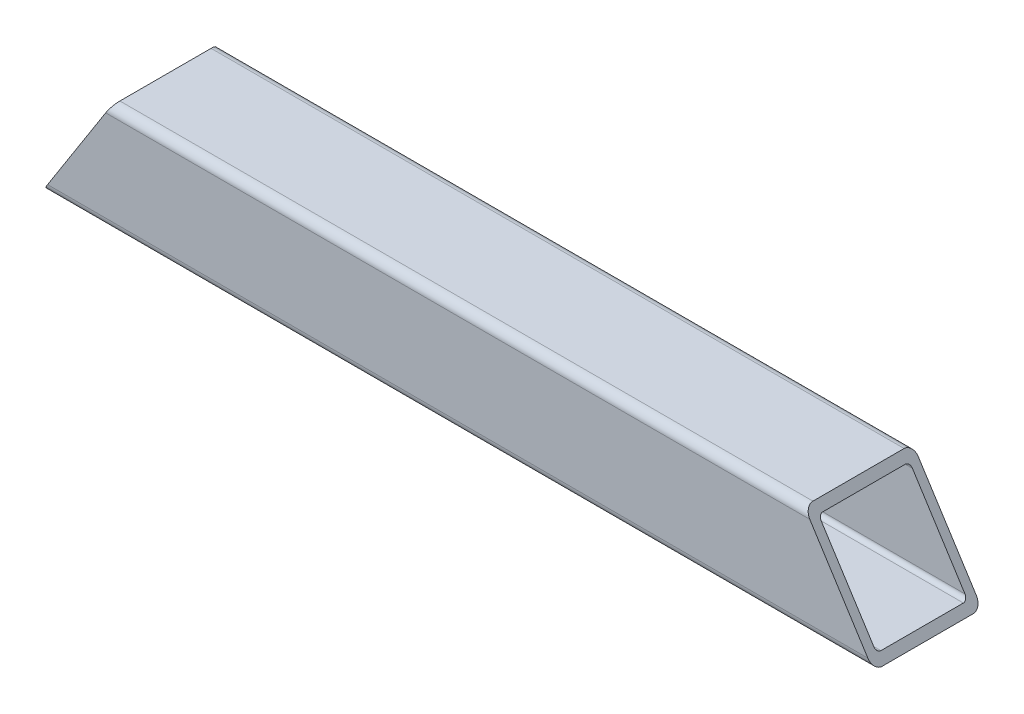
ISO-10303-21;
HEADER;
FILE_DESCRIPTION(('STEP AP214'),'2;1');
FILE_NAME('part.step','',(''),(''),'','','');
FILE_SCHEMA(('AUTOMOTIVE_DESIGN { 1 0 10303 214 1 1 1 1 }'));
ENDSEC;
DATA;
#1=APPLICATION_CONTEXT('core data for automotive mechanical design processes');
#2=APPLICATION_PROTOCOL_DEFINITION('international standard','automotive_design',2000,#1);
#3=PRODUCT_CONTEXT('',#1,'mechanical');
#4=PRODUCT('Part','Part','',(#3));
#5=PRODUCT_RELATED_PRODUCT_CATEGORY('part','',(#4));
#6=PRODUCT_DEFINITION_FORMATION('','',#4);
#7=PRODUCT_DEFINITION_CONTEXT('part definition',#1,'design');
#8=PRODUCT_DEFINITION('design','',#6,#7);
#9=PRODUCT_DEFINITION_SHAPE('','',#8);
#10=(LENGTH_UNIT() NAMED_UNIT(*) SI_UNIT(.MILLI.,.METRE.));
#11=(NAMED_UNIT(*) PLANE_ANGLE_UNIT() SI_UNIT($,.RADIAN.));
#12=(NAMED_UNIT(*) SI_UNIT($,.STERADIAN.) SOLID_ANGLE_UNIT());
#13=UNCERTAINTY_MEASURE_WITH_UNIT(LENGTH_MEASURE(1.E-05),#10,'distance_accuracy_value','');
#14=(GEOMETRIC_REPRESENTATION_CONTEXT(3) GLOBAL_UNCERTAINTY_ASSIGNED_CONTEXT((#13)) GLOBAL_UNIT_ASSIGNED_CONTEXT((#10,
#11,#12)) REPRESENTATION_CONTEXT('',''));
#15=CARTESIAN_POINT('',(0.,0.,0.));
#16=DIRECTION('',(0.,0.,1.));
#17=DIRECTION('',(1.,0.,0.));
#18=AXIS2_PLACEMENT_3D('',#15,#16,#17);
#19=CARTESIAN_POINT('',(191.5,10.5,9.5));
#20=DIRECTION('',(0.,-1.,0.));
#21=DIRECTION('',(0.,0.,-1.));
#22=AXIS2_PLACEMENT_3D('',#19,#20,#21);
#23=PLANE('',#22);
#24=DIRECTION('',(0.,0.,-1.));
#25=VECTOR('',#24,1.);
#26=CARTESIAN_POINT('',(14.6526159985721,10.5,-12.501));
#27=LINE('',#26,#25);
#28=CARTESIAN_POINT('',(14.6526159985721,10.5,9.5));
#29=VERTEX_POINT('',#28);
#30=CARTESIAN_POINT('',(14.6526159985721,10.5,-9.50000000000001));
#31=VERTEX_POINT('',#30);
#32=EDGE_CURVE('E482',#29,#31,#27,.T.);
#33=ORIENTED_EDGE('',*,*,#32,.T.);
#34=DIRECTION('',(-1.,0.,0.));
#35=VECTOR('',#34,1.);
#36=CARTESIAN_POINT('',(191.5,10.5,-9.50000000000001));
#37=LINE('',#36,#35);
#38=CARTESIAN_POINT('',(176.847384001428,10.5,-9.50000000000001));
#39=VERTEX_POINT('',#38);
#40=EDGE_CURVE('E284',#39,#31,#37,.T.);
#41=ORIENTED_EDGE('',*,*,#40,.F.);
#42=DIRECTION('',(0.,0.,1.));
#43=VECTOR('',#42,1.);
#44=CARTESIAN_POINT('',(176.847384001428,10.5,-12.501));
#45=LINE('',#44,#43);
#46=CARTESIAN_POINT('',(176.847384001428,10.5,9.5));
#47=VERTEX_POINT('',#46);
#48=EDGE_CURVE('E248',#39,#47,#45,.T.);
#49=ORIENTED_EDGE('',*,*,#48,.T.);
#50=DIRECTION('',(-1.,0.,0.));
#51=VECTOR('',#50,1.);
#52=CARTESIAN_POINT('',(191.5,10.5,9.5));
#53=LINE('',#52,#51);
#54=EDGE_CURVE('E233',#47,#29,#53,.T.);
#55=ORIENTED_EDGE('',*,*,#54,.T.);
#56=EDGE_LOOP('',(#33,#41,#49,#55));
#57=FACE_BOUND('',#56,.T.);
#58=ADVANCED_FACE('F39',(#57),#23,.T.);
#59=CARTESIAN_POINT('',(191.5,9.50000000000001,-9.50000000000001));
#60=DIRECTION('',(-1.,0.,0.));
#61=DIRECTION('',(0.,0.,1.));
#62=AXIS2_PLACEMENT_3D('',#59,#60,#61);
#63=CYLINDRICAL_SURFACE('',#62,0.999999999999999);
#64=CARTESIAN_POINT('',(14.0155457377647,9.50000000000001,-9.50000000000001));
#65=DIRECTION('',(0.843391445812889,-0.537299608346818,0.));
#66=DIRECTION('',(-0.537299608346819,-0.843391445812889,0.));
#67=AXIS2_PLACEMENT_3D('',#64,#65,#66);
#68=ELLIPSE('',#67,1.18568904743415,0.999999999999999);
#69=CARTESIAN_POINT('',(14.0155457377647,9.50000000000001,-10.5));
#70=VERTEX_POINT('',#69);
#71=EDGE_CURVE('E63',#31,#70,#68,.F.);
#72=ORIENTED_EDGE('',*,*,#71,.T.);
#73=DIRECTION('',(-1.,0.,0.));
#74=VECTOR('',#73,1.);
#75=CARTESIAN_POINT('',(191.5,9.50000000000001,-10.5));
#76=LINE('',#75,#74);
#77=CARTESIAN_POINT('',(177.484454262235,9.50000000000001,-10.5));
#78=VERTEX_POINT('',#77);
#79=EDGE_CURVE('E288',#78,#70,#76,.T.);
#80=ORIENTED_EDGE('',*,*,#79,.F.);
#81=CARTESIAN_POINT('',(177.484454262235,9.50000000000001,-9.50000000000001));
#82=DIRECTION('',(-0.843391445812889,-0.537299608346818,0.));
#83=DIRECTION('',(-0.537299608346819,0.843391445812889,0.));
#84=AXIS2_PLACEMENT_3D('',#81,#82,#83);
#85=ELLIPSE('',#84,1.18568904743415,0.999999999999999);
#86=EDGE_CURVE('E251',#78,#39,#85,.F.);
#87=ORIENTED_EDGE('',*,*,#86,.T.);
#88=ORIENTED_EDGE('',*,*,#40,.T.);
#89=EDGE_LOOP('',(#72,#80,#87,#88));
#90=FACE_BOUND('',#89,.T.);
#91=ADVANCED_FACE('F323',(#90),#63,.F.);
#92=CARTESIAN_POINT('',(191.5,9.50000000000001,-10.5));
#93=DIRECTION('',(0.,0.,1.));
#94=DIRECTION('',(1.,0.,0.));
#95=AXIS2_PLACEMENT_3D('',#92,#93,#94);
#96=PLANE('',#95);
#97=DIRECTION('',(-0.537299608346819,-0.843391445812889,0.));
#98=VECTOR('',#97,1.);
#99=CARTESIAN_POINT('',(0.,-12.5,-10.5));
#100=LINE('',#99,#98);
#101=CARTESIAN_POINT('',(1.91121078242253,-9.49999999999997,-10.5));
#102=VERTEX_POINT('',#101);
#103=EDGE_CURVE('E488',#70,#102,#100,.T.);
#104=ORIENTED_EDGE('',*,*,#103,.T.);
#105=DIRECTION('',(-1.,0.,0.));
#106=VECTOR('',#105,1.);
#107=CARTESIAN_POINT('',(191.5,-9.49999999999999,-10.5));
#108=LINE('',#107,#106);
#109=CARTESIAN_POINT('',(189.588789217578,-9.49999999999999,-10.5));
#110=VERTEX_POINT('',#109);
#111=EDGE_CURVE('E292',#110,#102,#108,.T.);
#112=ORIENTED_EDGE('',*,*,#111,.F.);
#113=DIRECTION('',(-0.537299608346819,0.843391445812889,0.));
#114=VECTOR('',#113,1.);
#115=CARTESIAN_POINT('',(191.5,-12.5,-10.5));
#116=LINE('',#115,#114);
#117=EDGE_CURVE('E255',#110,#78,#116,.T.);
#118=ORIENTED_EDGE('',*,*,#117,.T.);
#119=ORIENTED_EDGE('',*,*,#79,.T.);
#120=EDGE_LOOP('',(#104,#112,#118,#119));
#121=FACE_BOUND('',#120,.T.);
#122=ADVANCED_FACE('F329',(#121),#96,.T.);
#123=CARTESIAN_POINT('',(191.5,-9.5,-9.50000000000001));
#124=DIRECTION('',(-1.,0.,0.));
#125=DIRECTION('',(0.,0.,1.));
#126=AXIS2_PLACEMENT_3D('',#123,#124,#125);
#127=CYLINDRICAL_SURFACE('',#126,0.999999999999999);
#128=CARTESIAN_POINT('',(1.91121078242246,-9.5,-9.50000000000001));
#129=DIRECTION('',(0.843391445812889,-0.537299608346818,0.));
#130=DIRECTION('',(-0.537299608346819,-0.843391445812889,0.));
#131=AXIS2_PLACEMENT_3D('',#128,#129,#130);
#132=ELLIPSE('',#131,1.18568904743415,0.999999999999999);
#133=CARTESIAN_POINT('',(1.27414052161498,-10.5,-9.50000000000001));
#134=VERTEX_POINT('',#133);
#135=EDGE_CURVE('E495',#102,#134,#132,.F.);
#136=ORIENTED_EDGE('',*,*,#135,.T.);
#137=DIRECTION('',(-1.,0.,0.));
#138=VECTOR('',#137,1.);
#139=CARTESIAN_POINT('',(191.5,-10.5,-9.50000000000001));
#140=LINE('',#139,#138);
#141=CARTESIAN_POINT('',(190.225859478385,-10.5,-9.50000000000001));
#142=VERTEX_POINT('',#141);
#143=EDGE_CURVE('E296',#142,#134,#140,.T.);
#144=ORIENTED_EDGE('',*,*,#143,.F.);
#145=CARTESIAN_POINT('',(189.588789217578,-9.5,-9.50000000000001));
#146=DIRECTION('',(-0.843391445812889,-0.537299608346818,0.));
#147=DIRECTION('',(-0.537299608346819,0.843391445812889,0.));
#148=AXIS2_PLACEMENT_3D('',#145,#146,#147);
#149=ELLIPSE('',#148,1.18568904743415,0.999999999999999);
#150=EDGE_CURVE('E259',#142,#110,#149,.F.);
#151=ORIENTED_EDGE('',*,*,#150,.T.);
#152=ORIENTED_EDGE('',*,*,#111,.T.);
#153=EDGE_LOOP('',(#136,#144,#151,#152));
#154=FACE_BOUND('',#153,.T.);
#155=ADVANCED_FACE('F336',(#154),#127,.F.);
#156=CARTESIAN_POINT('',(191.5,-10.5,9.5));
#157=DIRECTION('',(0.,1.,0.));
#158=DIRECTION('',(0.,0.,1.));
#159=AXIS2_PLACEMENT_3D('',#156,#157,#158);
#160=PLANE('',#159);
#161=DIRECTION('',(0.,0.,1.));
#162=VECTOR('',#161,1.);
#163=CARTESIAN_POINT('',(1.27414052161497,-10.5,-12.501));
#164=LINE('',#163,#162);
#165=CARTESIAN_POINT('',(1.27414052161498,-10.5,9.5));
#166=VERTEX_POINT('',#165);
#167=EDGE_CURVE('E499',#134,#166,#164,.T.);
#168=ORIENTED_EDGE('',*,*,#167,.T.);
#169=DIRECTION('',(-1.,0.,0.));
#170=VECTOR('',#169,1.);
#171=CARTESIAN_POINT('',(191.5,-10.5,9.5));
#172=LINE('',#171,#170);
#173=CARTESIAN_POINT('',(190.225859478385,-10.5,9.5));
#174=VERTEX_POINT('',#173);
#175=EDGE_CURVE('E300',#174,#166,#172,.T.);
#176=ORIENTED_EDGE('',*,*,#175,.F.);
#177=DIRECTION('',(0.,0.,-1.));
#178=VECTOR('',#177,1.);
#179=CARTESIAN_POINT('',(190.225859478385,-10.5,-12.501));
#180=LINE('',#179,#178);
#181=EDGE_CURVE('E263',#174,#142,#180,.T.);
#182=ORIENTED_EDGE('',*,*,#181,.T.);
#183=ORIENTED_EDGE('',*,*,#143,.T.);
#184=EDGE_LOOP('',(#168,#176,#182,#183));
#185=FACE_BOUND('',#184,.T.);
#186=ADVANCED_FACE('F340',(#185),#160,.T.);
#187=CARTESIAN_POINT('',(191.5,-9.5,9.5));
#188=DIRECTION('',(-1.,0.,0.));
#189=DIRECTION('',(0.,0.,1.));
#190=AXIS2_PLACEMENT_3D('',#187,#188,#189);
#191=CYLINDRICAL_SURFACE('',#190,1.);
#192=CARTESIAN_POINT('',(1.91121078242246,-9.5,9.5));
#193=DIRECTION('',(0.843391445812889,-0.537299608346818,0.));
#194=DIRECTION('',(-0.537299608346819,-0.843391445812889,0.));
#195=AXIS2_PLACEMENT_3D('',#192,#193,#194);
#196=ELLIPSE('',#195,1.18568904743416,1.);
#197=CARTESIAN_POINT('',(1.91121078242246,-9.5,10.5));
#198=VERTEX_POINT('',#197);
#199=EDGE_CURVE('E503',#166,#198,#196,.F.);
#200=ORIENTED_EDGE('',*,*,#199,.T.);
#201=DIRECTION('',(-1.,0.,0.));
#202=VECTOR('',#201,1.);
#203=CARTESIAN_POINT('',(191.5,-9.5,10.5));
#204=LINE('',#203,#202);
#205=CARTESIAN_POINT('',(189.588789217578,-9.5,10.5));
#206=VERTEX_POINT('',#205);
#207=EDGE_CURVE('E304',#206,#198,#204,.T.);
#208=ORIENTED_EDGE('',*,*,#207,.F.);
#209=CARTESIAN_POINT('',(189.588789217578,-9.5,9.5));
#210=DIRECTION('',(-0.843391445812889,-0.537299608346818,0.));
#211=DIRECTION('',(-0.537299608346819,0.843391445812889,0.));
#212=AXIS2_PLACEMENT_3D('',#209,#210,#211);
#213=ELLIPSE('',#212,1.18568904743416,1.);
#214=EDGE_CURVE('E267',#206,#174,#213,.F.);
#215=ORIENTED_EDGE('',*,*,#214,.T.);
#216=ORIENTED_EDGE('',*,*,#175,.T.);
#217=EDGE_LOOP('',(#200,#208,#215,#216));
#218=FACE_BOUND('',#217,.T.);
#219=ADVANCED_FACE('F344',(#218),#191,.F.);
#220=CARTESIAN_POINT('',(191.5,9.50000000000001,10.5));
#221=DIRECTION('',(0.,0.,-1.));
#222=DIRECTION('',(-1.,0.,0.));
#223=AXIS2_PLACEMENT_3D('',#220,#221,#222);
#224=PLANE('',#223);
#225=DIRECTION('',(0.537299608346819,0.843391445812889,0.));
#226=VECTOR('',#225,1.);
#227=CARTESIAN_POINT('',(0.,-12.5,10.5));
#228=LINE('',#227,#226);
#229=CARTESIAN_POINT('',(14.0155457377647,9.50000000000003,10.5));
#230=VERTEX_POINT('',#229);
#231=EDGE_CURVE('E507',#198,#230,#228,.T.);
#232=ORIENTED_EDGE('',*,*,#231,.T.);
#233=DIRECTION('',(-1.,0.,0.));
#234=VECTOR('',#233,1.);
#235=CARTESIAN_POINT('',(191.5,9.50000000000001,10.5));
#236=LINE('',#235,#234);
#237=CARTESIAN_POINT('',(177.484454262235,9.50000000000001,10.5));
#238=VERTEX_POINT('',#237);
#239=EDGE_CURVE('E165',#238,#230,#236,.T.);
#240=ORIENTED_EDGE('',*,*,#239,.F.);
#241=DIRECTION('',(0.537299608346819,-0.843391445812889,0.));
#242=VECTOR('',#241,1.);
#243=CARTESIAN_POINT('',(191.5,-12.5,10.5));
#244=LINE('',#243,#242);
#245=EDGE_CURVE('E271',#238,#206,#244,.T.);
#246=ORIENTED_EDGE('',*,*,#245,.T.);
#247=ORIENTED_EDGE('',*,*,#207,.T.);
#248=EDGE_LOOP('',(#232,#240,#246,#247));
#249=FACE_BOUND('',#248,.T.);
#250=ADVANCED_FACE('F348',(#249),#224,.T.);
#251=CARTESIAN_POINT('',(191.5,9.50000000000001,9.5));
#252=DIRECTION('',(-1.,0.,0.));
#253=DIRECTION('',(0.,0.,1.));
#254=AXIS2_PLACEMENT_3D('',#251,#252,#253);
#255=CYLINDRICAL_SURFACE('',#254,1.);
#256=CARTESIAN_POINT('',(14.0155457377647,9.50000000000001,9.5));
#257=DIRECTION('',(0.843391445812889,-0.537299608346818,0.));
#258=DIRECTION('',(-0.537299608346819,-0.843391445812889,0.));
#259=AXIS2_PLACEMENT_3D('',#256,#257,#258);
#260=ELLIPSE('',#259,1.18568904743416,1.);
#261=EDGE_CURVE('E223',#230,#29,#260,.F.);
#262=ORIENTED_EDGE('',*,*,#261,.T.);
#263=ORIENTED_EDGE('',*,*,#54,.F.);
#264=CARTESIAN_POINT('',(177.484454262235,9.50000000000001,9.5));
#265=DIRECTION('',(-0.843391445812889,-0.537299608346818,0.));
#266=DIRECTION('',(-0.537299608346819,0.843391445812889,0.));
#267=AXIS2_PLACEMENT_3D('',#264,#265,#266);
#268=ELLIPSE('',#267,1.18568904743416,1.);
#269=EDGE_CURVE('E55',#47,#238,#268,.F.);
#270=ORIENTED_EDGE('',*,*,#269,.T.);
#271=ORIENTED_EDGE('',*,*,#239,.T.);
#272=EDGE_LOOP('',(#262,#263,#270,#271));
#273=FACE_BOUND('',#272,.T.);
#274=ADVANCED_FACE('F352',(#273),#255,.F.);
#275=CARTESIAN_POINT('',(191.5,-12.5,-12.501));
#276=DIRECTION('',(-0.843391445812889,-0.537299608346818,0.));
#277=DIRECTION('',(0.537299608346819,-0.843391445812889,0.));
#278=AXIS2_PLACEMENT_3D('',#275,#276,#277);
#279=PLANE('',#278);
#280=ORIENTED_EDGE('',*,*,#48,.F.);
#281=ORIENTED_EDGE('',*,*,#86,.F.);
#282=ORIENTED_EDGE('',*,*,#117,.F.);
#283=ORIENTED_EDGE('',*,*,#150,.F.);
#284=ORIENTED_EDGE('',*,*,#181,.F.);
#285=ORIENTED_EDGE('',*,*,#214,.F.);
#286=ORIENTED_EDGE('',*,*,#245,.F.);
#287=ORIENTED_EDGE('',*,*,#269,.F.);
#288=EDGE_LOOP('',(#280,#281,#282,#283,#284,#285,#286,#287));
#289=FACE_BOUND('',#288,.T.);
#290=CARTESIAN_POINT('',(190.225859478385,-10.5,-10.5));
#291=DIRECTION('',(-0.843391445812889,-0.537299608346818,0.));
#292=DIRECTION('',(-0.537299608346819,0.843391445812889,0.));
#293=AXIS2_PLACEMENT_3D('',#290,#291,#292);
#294=ELLIPSE('',#293,2.37137809486831,2.);
#295=CARTESIAN_POINT('',(191.5,-12.5,-10.5));
#296=VERTEX_POINT('',#295);
#297=CARTESIAN_POINT('',(190.225859478385,-10.5,-12.5));
#298=VERTEX_POINT('',#297);
#299=EDGE_CURVE('E178',#296,#298,#294,.F.);
#300=ORIENTED_EDGE('',*,*,#299,.T.);
#301=DIRECTION('',(-0.537299608346819,0.843391445812889,0.));
#302=VECTOR('',#301,1.);
#303=CARTESIAN_POINT('',(191.5,-12.5,-12.5));
#304=LINE('',#303,#302);
#305=CARTESIAN_POINT('',(176.847384001428,10.5,-12.5));
#306=VERTEX_POINT('',#305);
#307=EDGE_CURVE('E214',#298,#306,#304,.T.);
#308=ORIENTED_EDGE('',*,*,#307,.T.);
#309=CARTESIAN_POINT('',(176.847384001428,10.5,-10.5));
#310=DIRECTION('',(-0.843391445812889,-0.537299608346818,0.));
#311=DIRECTION('',(-0.537299608346819,0.843391445812889,0.));
#312=AXIS2_PLACEMENT_3D('',#309,#310,#311);
#313=ELLIPSE('',#312,2.37137809486831,2.);
#314=CARTESIAN_POINT('',(175.573243479813,12.5,-10.5));
#315=VERTEX_POINT('',#314);
#316=EDGE_CURVE('E209',#306,#315,#313,.F.);
#317=ORIENTED_EDGE('',*,*,#316,.T.);
#318=DIRECTION('',(0.,0.,1.));
#319=VECTOR('',#318,1.);
#320=CARTESIAN_POINT('',(175.573243479813,12.5,-12.501));
#321=LINE('',#320,#319);
#322=CARTESIAN_POINT('',(175.573243479813,12.5,10.5));
#323=VERTEX_POINT('',#322);
#324=EDGE_CURVE('E245',#315,#323,#321,.T.);
#325=ORIENTED_EDGE('',*,*,#324,.T.);
#326=CARTESIAN_POINT('',(176.847384001428,10.5,10.5));
#327=DIRECTION('',(-0.843391445812889,-0.537299608346818,0.));
#328=DIRECTION('',(-0.537299608346819,0.843391445812889,0.));
#329=AXIS2_PLACEMENT_3D('',#326,#327,#328);
#330=ELLIPSE('',#329,2.37137809486831,2.);
#331=CARTESIAN_POINT('',(176.847384001428,10.5,12.5));
#332=VERTEX_POINT('',#331);
#333=EDGE_CURVE('E237',#323,#332,#330,.F.);
#334=ORIENTED_EDGE('',*,*,#333,.T.);
#335=DIRECTION('',(0.537299608346818,-0.843391445812889,0.));
#336=VECTOR('',#335,1.);
#337=CARTESIAN_POINT('',(191.5,-12.5,12.5));
#338=LINE('',#337,#336);
#339=CARTESIAN_POINT('',(190.225859478385,-10.5,12.5));
#340=VERTEX_POINT('',#339);
#341=EDGE_CURVE('E242',#332,#340,#338,.T.);
#342=ORIENTED_EDGE('',*,*,#341,.T.);
#343=CARTESIAN_POINT('',(190.225859478385,-10.5,10.5));
#344=DIRECTION('',(-0.843391445812889,-0.537299608346818,0.));
#345=DIRECTION('',(-0.537299608346819,0.843391445812889,0.));
#346=AXIS2_PLACEMENT_3D('',#343,#344,#345);
#347=ELLIPSE('',#346,2.37137809486831,2.);
#348=CARTESIAN_POINT('',(191.5,-12.5,10.5));
#349=VERTEX_POINT('',#348);
#350=EDGE_CURVE('E234',#340,#349,#347,.F.);
#351=ORIENTED_EDGE('',*,*,#350,.T.);
#352=DIRECTION('',(0.,0.,-1.));
#353=VECTOR('',#352,1.);
#354=CARTESIAN_POINT('',(191.5,-12.5,-10.5));
#355=LINE('',#354,#353);
#356=EDGE_CURVE('E164',#349,#296,#355,.T.);
#357=ORIENTED_EDGE('',*,*,#356,.T.);
#358=EDGE_LOOP('',(#300,#308,#317,#325,#334,#342,#351,#357));
#359=FACE_BOUND('',#358,.T.);
#360=ADVANCED_FACE('F314',(#289,#359),#279,.F.);
#361=CARTESIAN_POINT('',(0.,-12.5,-12.501));
#362=DIRECTION('',(0.843391445812889,-0.537299608346818,0.));
#363=DIRECTION('',(0.537299608346819,0.843391445812889,0.));
#364=AXIS2_PLACEMENT_3D('',#361,#362,#363);
#365=PLANE('',#364);
#366=ORIENTED_EDGE('',*,*,#231,.F.);
#367=ORIENTED_EDGE('',*,*,#199,.F.);
#368=ORIENTED_EDGE('',*,*,#167,.F.);
#369=ORIENTED_EDGE('',*,*,#135,.F.);
#370=ORIENTED_EDGE('',*,*,#103,.F.);
#371=ORIENTED_EDGE('',*,*,#71,.F.);
#372=ORIENTED_EDGE('',*,*,#32,.F.);
#373=ORIENTED_EDGE('',*,*,#261,.F.);
#374=EDGE_LOOP('',(#366,#367,#368,#369,#370,#371,#372,#373));
#375=FACE_BOUND('',#374,.T.);
#376=CARTESIAN_POINT('',(1.27414052161498,-10.5,-10.5));
#377=DIRECTION('',(0.843391445812889,-0.537299608346818,0.));
#378=DIRECTION('',(-0.537299608346819,-0.843391445812889,0.));
#379=AXIS2_PLACEMENT_3D('',#376,#377,#378);
#380=ELLIPSE('',#379,2.37137809486831,2.);
#381=CARTESIAN_POINT('',(1.27414052161497,-10.5,-12.5));
#382=VERTEX_POINT('',#381);
#383=CARTESIAN_POINT('',(0.,-12.5,-10.5));
#384=VERTEX_POINT('',#383);
#385=EDGE_CURVE('E158',#382,#384,#380,.F.);
#386=ORIENTED_EDGE('',*,*,#385,.T.);
#387=DIRECTION('',(0.,0.,-1.));
#388=VECTOR('',#387,1.);
#389=CARTESIAN_POINT('',(0.,-12.5,-10.5));
#390=LINE('',#389,#388);
#391=CARTESIAN_POINT('',(0.,-12.5,10.5));
#392=VERTEX_POINT('',#391);
#393=EDGE_CURVE('E152',#392,#384,#390,.T.);
#394=ORIENTED_EDGE('',*,*,#393,.F.);
#395=CARTESIAN_POINT('',(1.27414052161498,-10.5,10.5));
#396=DIRECTION('',(0.843391445812889,-0.537299608346818,0.));
#397=DIRECTION('',(-0.537299608346819,-0.843391445812889,0.));
#398=AXIS2_PLACEMENT_3D('',#395,#396,#397);
#399=ELLIPSE('',#398,2.37137809486831,2.);
#400=CARTESIAN_POINT('',(1.27414052161496,-10.5,12.5));
#401=VERTEX_POINT('',#400);
#402=EDGE_CURVE('E155',#392,#401,#399,.F.);
#403=ORIENTED_EDGE('',*,*,#402,.T.);
#404=DIRECTION('',(0.537299608346818,0.843391445812889,0.));
#405=VECTOR('',#404,1.);
#406=CARTESIAN_POINT('',(0.,-12.5,12.5));
#407=LINE('',#406,#405);
#408=CARTESIAN_POINT('',(14.6526159985721,10.5,12.5));
#409=VERTEX_POINT('',#408);
#410=EDGE_CURVE('E221',#401,#409,#407,.T.);
#411=ORIENTED_EDGE('',*,*,#410,.T.);
#412=CARTESIAN_POINT('',(14.6526159985721,10.5,10.5));
#413=DIRECTION('',(0.843391445812889,-0.537299608346818,0.));
#414=DIRECTION('',(-0.537299608346819,-0.843391445812889,0.));
#415=AXIS2_PLACEMENT_3D('',#412,#413,#414);
#416=ELLIPSE('',#415,2.37137809486831,2.);
#417=CARTESIAN_POINT('',(15.9267565201871,12.5,10.5));
#418=VERTEX_POINT('',#417);
#419=EDGE_CURVE('E177',#409,#418,#416,.F.);
#420=ORIENTED_EDGE('',*,*,#419,.T.);
#421=DIRECTION('',(0.,0.,1.));
#422=VECTOR('',#421,1.);
#423=CARTESIAN_POINT('',(15.9267565201871,12.5,-12.501));
#424=LINE('',#423,#422);
#425=CARTESIAN_POINT('',(15.9267565201871,12.5,-10.5));
#426=VERTEX_POINT('',#425);
#427=EDGE_CURVE('E229',#426,#418,#424,.T.);
#428=ORIENTED_EDGE('',*,*,#427,.F.);
#429=CARTESIAN_POINT('',(14.6526159985721,10.5,-10.5));
#430=DIRECTION('',(0.843391445812889,-0.537299608346818,0.));
#431=DIRECTION('',(-0.537299608346819,-0.843391445812889,0.));
#432=AXIS2_PLACEMENT_3D('',#429,#430,#431);
#433=ELLIPSE('',#432,2.37137809486831,2.);
#434=CARTESIAN_POINT('',(14.6526159985721,10.5,-12.5));
#435=VERTEX_POINT('',#434);
#436=EDGE_CURVE('E208',#426,#435,#433,.F.);
#437=ORIENTED_EDGE('',*,*,#436,.T.);
#438=DIRECTION('',(-0.537299608346819,-0.843391445812889,0.));
#439=VECTOR('',#438,1.);
#440=CARTESIAN_POINT('',(0.,-12.5,-12.5));
#441=LINE('',#440,#439);
#442=EDGE_CURVE('E216',#435,#382,#441,.T.);
#443=ORIENTED_EDGE('',*,*,#442,.T.);
#444=EDGE_LOOP('',(#386,#394,#403,#411,#420,#428,#437,#443));
#445=FACE_BOUND('',#444,.T.);
#446=ADVANCED_FACE('F154',(#375,#445),#365,.F.);
#447=CARTESIAN_POINT('',(191.5,-10.5,-10.5));
#448=DIRECTION('',(-1.,0.,0.));
#449=DIRECTION('',(0.,0.,1.));
#450=AXIS2_PLACEMENT_3D('',#447,#448,#449);
#451=CYLINDRICAL_SURFACE('',#450,2.);
#452=DIRECTION('',(-1.,0.,0.));
#453=VECTOR('',#452,1.);
#454=CARTESIAN_POINT('',(191.5,-12.5,-10.5));
#455=LINE('',#454,#453);
#456=EDGE_CURVE('E182',#296,#384,#455,.T.);
#457=ORIENTED_EDGE('',*,*,#456,.T.);
#458=ORIENTED_EDGE('',*,*,#385,.F.);
#459=DIRECTION('',(-1.,0.,0.));
#460=VECTOR('',#459,1.);
#461=CARTESIAN_POINT('',(191.5,-10.5,-12.5));
#462=LINE('',#461,#460);
#463=EDGE_CURVE('E11',#298,#382,#462,.T.);
#464=ORIENTED_EDGE('',*,*,#463,.F.);
#465=ORIENTED_EDGE('',*,*,#299,.F.);
#466=EDGE_LOOP('',(#457,#458,#464,#465));
#467=FACE_BOUND('',#466,.T.);
#468=ADVANCED_FACE('F41',(#467),#451,.T.);
#469=CARTESIAN_POINT('',(191.5,10.5,-12.5));
#470=DIRECTION('',(0.,0.,1.));
#471=DIRECTION('',(0.,-1.,0.));
#472=AXIS2_PLACEMENT_3D('',#469,#470,#471);
#473=PLANE('',#472);
#474=ORIENTED_EDGE('',*,*,#463,.T.);
#475=ORIENTED_EDGE('',*,*,#442,.F.);
#476=DIRECTION('',(-1.,0.,0.));
#477=VECTOR('',#476,1.);
#478=CARTESIAN_POINT('',(191.5,10.5,-12.5));
#479=LINE('',#478,#477);
#480=EDGE_CURVE('E48',#306,#435,#479,.T.);
#481=ORIENTED_EDGE('',*,*,#480,.F.);
#482=ORIENTED_EDGE('',*,*,#307,.F.);
#483=EDGE_LOOP('',(#474,#475,#481,#482));
#484=FACE_BOUND('',#483,.T.);
#485=ADVANCED_FACE('F213',(#484),#473,.F.);
#486=CARTESIAN_POINT('',(191.5,10.5,-10.5));
#487=DIRECTION('',(-1.,0.,0.));
#488=DIRECTION('',(0.,0.,1.));
#489=AXIS2_PLACEMENT_3D('',#486,#487,#488);
#490=CYLINDRICAL_SURFACE('',#489,2.);
#491=ORIENTED_EDGE('',*,*,#480,.T.);
#492=ORIENTED_EDGE('',*,*,#436,.F.);
#493=DIRECTION('',(-1.,0.,0.));
#494=VECTOR('',#493,1.);
#495=CARTESIAN_POINT('',(191.5,12.5,-10.5));
#496=LINE('',#495,#494);
#497=EDGE_CURVE('E197',#315,#426,#496,.T.);
#498=ORIENTED_EDGE('',*,*,#497,.F.);
#499=ORIENTED_EDGE('',*,*,#316,.F.);
#500=EDGE_LOOP('',(#491,#492,#498,#499));
#501=FACE_BOUND('',#500,.T.);
#502=ADVANCED_FACE('F206',(#501),#490,.T.);
#503=CARTESIAN_POINT('',(191.5,12.5,-10.5));
#504=DIRECTION('',(0.,-1.,0.));
#505=DIRECTION('',(0.,0.,-1.));
#506=AXIS2_PLACEMENT_3D('',#503,#504,#505);
#507=PLANE('',#506);
#508=ORIENTED_EDGE('',*,*,#497,.T.);
#509=ORIENTED_EDGE('',*,*,#427,.T.);
#510=DIRECTION('',(-1.,0.,0.));
#511=VECTOR('',#510,1.);
#512=CARTESIAN_POINT('',(191.5,12.5,10.5));
#513=LINE('',#512,#511);
#514=EDGE_CURVE('E193',#323,#418,#513,.T.);
#515=ORIENTED_EDGE('',*,*,#514,.F.);
#516=ORIENTED_EDGE('',*,*,#324,.F.);
#517=EDGE_LOOP('',(#508,#509,#515,#516));
#518=FACE_BOUND('',#517,.T.);
#519=ADVANCED_FACE('F368',(#518),#507,.F.);
#520=CARTESIAN_POINT('',(191.5,10.5,10.5));
#521=DIRECTION('',(-1.,0.,0.));
#522=DIRECTION('',(0.,0.,1.));
#523=AXIS2_PLACEMENT_3D('',#520,#521,#522);
#524=CYLINDRICAL_SURFACE('',#523,2.);
#525=ORIENTED_EDGE('',*,*,#514,.T.);
#526=ORIENTED_EDGE('',*,*,#419,.F.);
#527=DIRECTION('',(-1.,0.,0.));
#528=VECTOR('',#527,1.);
#529=CARTESIAN_POINT('',(191.5,10.5,12.5));
#530=LINE('',#529,#528);
#531=EDGE_CURVE('E186',#332,#409,#530,.T.);
#532=ORIENTED_EDGE('',*,*,#531,.F.);
#533=ORIENTED_EDGE('',*,*,#333,.F.);
#534=EDGE_LOOP('',(#525,#526,#532,#533));
#535=FACE_BOUND('',#534,.T.);
#536=ADVANCED_FACE('F364',(#535),#524,.T.);
#537=CARTESIAN_POINT('',(191.5,10.5,12.5));
#538=DIRECTION('',(0.,0.,-1.));
#539=DIRECTION('',(-1.,0.,0.));
#540=AXIS2_PLACEMENT_3D('',#537,#538,#539);
#541=PLANE('',#540);
#542=ORIENTED_EDGE('',*,*,#531,.T.);
#543=ORIENTED_EDGE('',*,*,#410,.F.);
#544=DIRECTION('',(-1.,0.,0.));
#545=VECTOR('',#544,1.);
#546=CARTESIAN_POINT('',(191.5,-10.5,12.5));
#547=LINE('',#546,#545);
#548=EDGE_CURVE('E175',#340,#401,#547,.T.);
#549=ORIENTED_EDGE('',*,*,#548,.F.);
#550=ORIENTED_EDGE('',*,*,#341,.F.);
#551=EDGE_LOOP('',(#542,#543,#549,#550));
#552=FACE_BOUND('',#551,.T.);
#553=ADVANCED_FACE('F361',(#552),#541,.F.);
#554=CARTESIAN_POINT('',(191.5,-10.5,10.5));
#555=DIRECTION('',(-1.,0.,0.));
#556=DIRECTION('',(0.,0.,1.));
#557=AXIS2_PLACEMENT_3D('',#554,#555,#556);
#558=CYLINDRICAL_SURFACE('',#557,2.);
#559=ORIENTED_EDGE('',*,*,#548,.T.);
#560=ORIENTED_EDGE('',*,*,#402,.F.);
#561=DIRECTION('',(-1.,0.,0.));
#562=VECTOR('',#561,1.);
#563=CARTESIAN_POINT('',(191.5,-12.5,10.5));
#564=LINE('',#563,#562);
#565=EDGE_CURVE('E172',#349,#392,#564,.T.);
#566=ORIENTED_EDGE('',*,*,#565,.F.);
#567=ORIENTED_EDGE('',*,*,#350,.F.);
#568=EDGE_LOOP('',(#559,#560,#566,#567));
#569=FACE_BOUND('',#568,.T.);
#570=ADVANCED_FACE('F170',(#569),#558,.T.);
#571=CARTESIAN_POINT('',(191.5,-12.5,-10.5));
#572=DIRECTION('',(0.,1.,0.));
#573=DIRECTION('',(0.,0.,1.));
#574=AXIS2_PLACEMENT_3D('',#571,#572,#573);
#575=PLANE('',#574);
#576=ORIENTED_EDGE('',*,*,#393,.T.);
#577=ORIENTED_EDGE('',*,*,#456,.F.);
#578=ORIENTED_EDGE('',*,*,#356,.F.);
#579=ORIENTED_EDGE('',*,*,#565,.T.);
#580=EDGE_LOOP('',(#576,#577,#578,#579));
#581=FACE_BOUND('',#580,.T.);
#582=ADVANCED_FACE('F180',(#581),#575,.F.);
#583=CLOSED_SHELL('',(#58,#91,#122,#155,#186,#219,#250,#274,#360,#446,#468,#485,#502,#519,#536,
#553,#570,#582));
#584=MANIFOLD_SOLID_BREP('B2',#583);
#585=ADVANCED_BREP_SHAPE_REPRESENTATION('',(#18,#584),#14);
#586=SHAPE_DEFINITION_REPRESENTATION(#9,#585);
ENDSEC;
END-ISO-10303-21;
